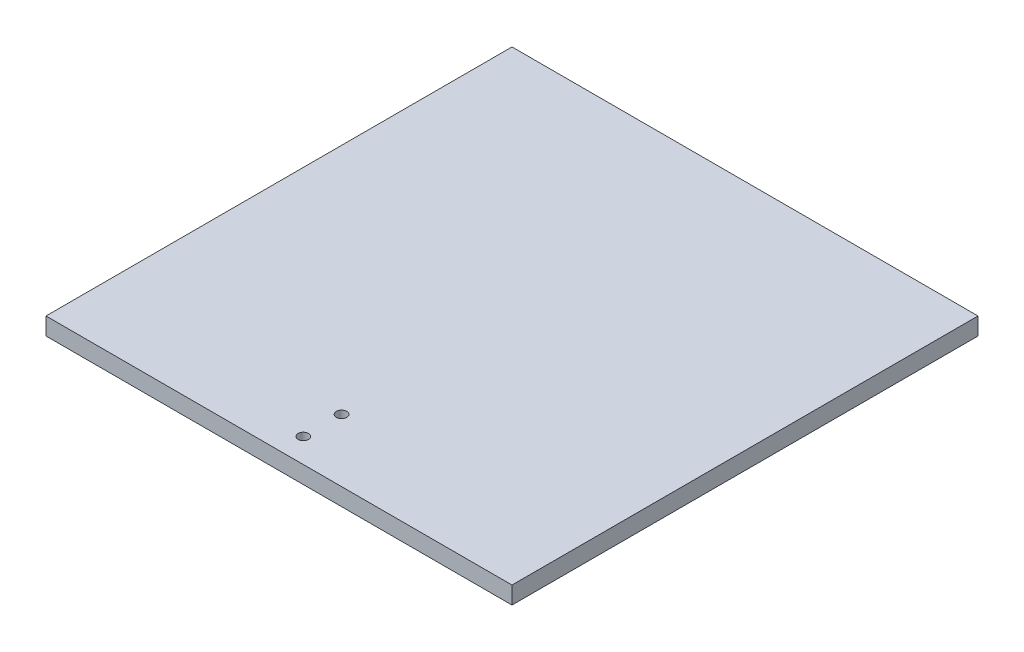
ISO-10303-21;
HEADER;
FILE_DESCRIPTION(('STEP AP214'),'2;1');
FILE_NAME('part.step','',(''),(''),'','','');
FILE_SCHEMA(('AUTOMOTIVE_DESIGN { 1 0 10303 214 1 1 1 1 }'));
ENDSEC;
DATA;
#1=APPLICATION_CONTEXT('core data for automotive mechanical design processes');
#2=APPLICATION_PROTOCOL_DEFINITION('international standard','automotive_design',2000,#1);
#3=PRODUCT_CONTEXT('',#1,'mechanical');
#4=PRODUCT('Part','Part','',(#3));
#5=PRODUCT_RELATED_PRODUCT_CATEGORY('part','',(#4));
#6=PRODUCT_DEFINITION_FORMATION('','',#4);
#7=PRODUCT_DEFINITION_CONTEXT('part definition',#1,'design');
#8=PRODUCT_DEFINITION('design','',#6,#7);
#9=PRODUCT_DEFINITION_SHAPE('','',#8);
#10=(LENGTH_UNIT() NAMED_UNIT(*) SI_UNIT(.MILLI.,.METRE.));
#11=(NAMED_UNIT(*) PLANE_ANGLE_UNIT() SI_UNIT($,.RADIAN.));
#12=(NAMED_UNIT(*) SI_UNIT($,.STERADIAN.) SOLID_ANGLE_UNIT());
#13=UNCERTAINTY_MEASURE_WITH_UNIT(LENGTH_MEASURE(1.E-05),#10,'distance_accuracy_value','');
#14=(GEOMETRIC_REPRESENTATION_CONTEXT(3) GLOBAL_UNCERTAINTY_ASSIGNED_CONTEXT((#13)) GLOBAL_UNIT_ASSIGNED_CONTEXT((#10,
#11,#12)) REPRESENTATION_CONTEXT('',''));
#15=CARTESIAN_POINT('',(0.,0.,0.));
#16=DIRECTION('',(0.,0.,1.));
#17=DIRECTION('',(1.,0.,0.));
#18=AXIS2_PLACEMENT_3D('',#15,#16,#17);
#19=CARTESIAN_POINT('',(-32.7467550804511,5.,-60.336983722081));
#20=DIRECTION('',(1.,0.,0.));
#21=DIRECTION('',(0.,0.,-1.));
#22=AXIS2_PLACEMENT_3D('',#19,#20,#21);
#23=PLANE('',#22);
#24=DIRECTION('',(0.,0.,1.));
#25=VECTOR('',#24,1.);
#26=CARTESIAN_POINT('',(-32.7467550804511,0.,-60.336983722081));
#27=LINE('',#26,#25);
#28=CARTESIAN_POINT('',(-32.7467550804511,0.,-60.336983722081));
#29=VERTEX_POINT('',#28);
#30=CARTESIAN_POINT('',(-32.7467550804511,0.,73.733016277919));
#31=VERTEX_POINT('',#30);
#32=EDGE_CURVE('E96',#29,#31,#27,.T.);
#33=ORIENTED_EDGE('',*,*,#32,.T.);
#34=DIRECTION('',(0.,-1.,0.));
#35=VECTOR('',#34,1.);
#36=CARTESIAN_POINT('',(-32.7467550804511,5.,73.733016277919));
#37=LINE('',#36,#35);
#38=CARTESIAN_POINT('',(-32.7467550804511,5.,73.733016277919));
#39=VERTEX_POINT('',#38);
#40=EDGE_CURVE('E11',#39,#31,#37,.T.);
#41=ORIENTED_EDGE('',*,*,#40,.F.);
#42=DIRECTION('',(0.,0.,1.));
#43=VECTOR('',#42,1.);
#44=CARTESIAN_POINT('',(-32.7467550804511,5.,-60.336983722081));
#45=LINE('',#44,#43);
#46=CARTESIAN_POINT('',(-32.7467550804511,5.,-60.336983722081));
#47=VERTEX_POINT('',#46);
#48=EDGE_CURVE('E84',#47,#39,#45,.T.);
#49=ORIENTED_EDGE('',*,*,#48,.F.);
#50=DIRECTION('',(0.,-1.,0.));
#51=VECTOR('',#50,1.);
#52=CARTESIAN_POINT('',(-32.7467550804511,5.,-60.336983722081));
#53=LINE('',#52,#51);
#54=EDGE_CURVE('E92',#47,#29,#53,.T.);
#55=ORIENTED_EDGE('',*,*,#54,.T.);
#56=EDGE_LOOP('',(#33,#41,#49,#55));
#57=FACE_BOUND('',#56,.T.);
#58=ADVANCED_FACE('F33',(#57),#23,.F.);
#59=CARTESIAN_POINT('',(-32.7467550804511,5.,73.733016277919));
#60=DIRECTION('',(0.,0.,-1.));
#61=DIRECTION('',(-1.,0.,0.));
#62=AXIS2_PLACEMENT_3D('',#59,#60,#61);
#63=PLANE('',#62);
#64=DIRECTION('',(1.,0.,0.));
#65=VECTOR('',#64,1.);
#66=CARTESIAN_POINT('',(-32.7467550804511,0.,73.733016277919));
#67=LINE('',#66,#65);
#68=CARTESIAN_POINT('',(101.323244919549,0.,73.733016277919));
#69=VERTEX_POINT('',#68);
#70=EDGE_CURVE('E88',#31,#69,#67,.T.);
#71=ORIENTED_EDGE('',*,*,#70,.T.);
#72=DIRECTION('',(0.,-1.,0.));
#73=VECTOR('',#72,1.);
#74=CARTESIAN_POINT('',(101.323244919549,5.,73.733016277919));
#75=LINE('',#74,#73);
#76=CARTESIAN_POINT('',(101.323244919549,5.,73.733016277919));
#77=VERTEX_POINT('',#76);
#78=EDGE_CURVE('E41',#77,#69,#75,.T.);
#79=ORIENTED_EDGE('',*,*,#78,.F.);
#80=DIRECTION('',(1.,0.,0.));
#81=VECTOR('',#80,1.);
#82=CARTESIAN_POINT('',(-32.7467550804511,5.,73.733016277919));
#83=LINE('',#82,#81);
#84=EDGE_CURVE('E79',#39,#77,#83,.T.);
#85=ORIENTED_EDGE('',*,*,#84,.F.);
#86=ORIENTED_EDGE('',*,*,#40,.T.);
#87=EDGE_LOOP('',(#71,#79,#85,#86));
#88=FACE_BOUND('',#87,.T.);
#89=ADVANCED_FACE('F87',(#88),#63,.F.);
#90=CARTESIAN_POINT('',(101.323244919549,5.,-60.336983722081));
#91=DIRECTION('',(-1.,0.,0.));
#92=DIRECTION('',(0.,0.,1.));
#93=AXIS2_PLACEMENT_3D('',#90,#91,#92);
#94=PLANE('',#93);
#95=DIRECTION('',(0.,0.,-1.));
#96=VECTOR('',#95,1.);
#97=CARTESIAN_POINT('',(101.323244919549,0.,-60.336983722081));
#98=LINE('',#97,#96);
#99=CARTESIAN_POINT('',(101.323244919549,0.,-60.336983722081));
#100=VERTEX_POINT('',#99);
#101=EDGE_CURVE('E66',#69,#100,#98,.T.);
#102=ORIENTED_EDGE('',*,*,#101,.T.);
#103=DIRECTION('',(0.,-1.,0.));
#104=VECTOR('',#103,1.);
#105=CARTESIAN_POINT('',(101.323244919549,5.,-60.336983722081));
#106=LINE('',#105,#104);
#107=CARTESIAN_POINT('',(101.323244919549,5.,-60.336983722081));
#108=VERTEX_POINT('',#107);
#109=EDGE_CURVE('E89',#108,#100,#106,.T.);
#110=ORIENTED_EDGE('',*,*,#109,.F.);
#111=DIRECTION('',(0.,0.,-1.));
#112=VECTOR('',#111,1.);
#113=CARTESIAN_POINT('',(101.323244919549,5.,-60.336983722081));
#114=LINE('',#113,#112);
#115=EDGE_CURVE('E82',#77,#108,#114,.T.);
#116=ORIENTED_EDGE('',*,*,#115,.F.);
#117=ORIENTED_EDGE('',*,*,#78,.T.);
#118=EDGE_LOOP('',(#102,#110,#116,#117));
#119=FACE_BOUND('',#118,.T.);
#120=ADVANCED_FACE('F90',(#119),#94,.F.);
#121=CARTESIAN_POINT('',(-32.7467550804511,5.,-60.336983722081));
#122=DIRECTION('',(0.,0.,1.));
#123=DIRECTION('',(1.,0.,0.));
#124=AXIS2_PLACEMENT_3D('',#121,#122,#123);
#125=PLANE('',#124);
#126=DIRECTION('',(-1.,0.,0.));
#127=VECTOR('',#126,1.);
#128=CARTESIAN_POINT('',(-32.7467550804511,0.,-60.336983722081));
#129=LINE('',#128,#127);
#130=EDGE_CURVE('E72',#100,#29,#129,.T.);
#131=ORIENTED_EDGE('',*,*,#130,.T.);
#132=ORIENTED_EDGE('',*,*,#54,.F.);
#133=DIRECTION('',(-1.,0.,0.));
#134=VECTOR('',#133,1.);
#135=CARTESIAN_POINT('',(-32.7467550804511,5.,-60.336983722081));
#136=LINE('',#135,#134);
#137=EDGE_CURVE('E49',#108,#47,#136,.T.);
#138=ORIENTED_EDGE('',*,*,#137,.F.);
#139=ORIENTED_EDGE('',*,*,#109,.T.);
#140=EDGE_LOOP('',(#131,#132,#138,#139));
#141=FACE_BOUND('',#140,.T.);
#142=ADVANCED_FACE('F104',(#141),#125,.F.);
#143=CARTESIAN_POINT('',(0.,5.,0.));
#144=DIRECTION('',(0.,1.,0.));
#145=DIRECTION('',(0.,0.,1.));
#146=AXIS2_PLACEMENT_3D('',#143,#144,#145);
#147=PLANE('',#146);
#148=CARTESIAN_POINT('',(34.2882449195489,5.,66.733016277919));
#149=DIRECTION('',(0.,1.,0.));
#150=DIRECTION('',(0.,0.,1.));
#151=AXIS2_PLACEMENT_3D('',#148,#149,#150);
#152=CIRCLE('',#151,1.5);
#153=CARTESIAN_POINT('',(34.2882449195489,5.,68.233016277919));
#154=VERTEX_POINT('',#153);
#155=EDGE_CURVE('E116',#154,#154,#152,.T.);
#156=ORIENTED_EDGE('',*,*,#155,.F.);
#157=EDGE_LOOP('',(#156));
#158=FACE_BOUND('',#157,.T.);
#159=CARTESIAN_POINT('',(34.2882449195489,5.,55.733016277919));
#160=DIRECTION('',(0.,1.,0.));
#161=DIRECTION('',(0.,0.,1.));
#162=AXIS2_PLACEMENT_3D('',#159,#160,#161);
#163=CIRCLE('',#162,1.5);
#164=CARTESIAN_POINT('',(34.2882449195489,5.,57.233016277919));
#165=VERTEX_POINT('',#164);
#166=EDGE_CURVE('E110',#165,#165,#163,.T.);
#167=ORIENTED_EDGE('',*,*,#166,.F.);
#168=EDGE_LOOP('',(#167));
#169=FACE_BOUND('',#168,.T.);
#170=ORIENTED_EDGE('',*,*,#48,.T.);
#171=ORIENTED_EDGE('',*,*,#84,.T.);
#172=ORIENTED_EDGE('',*,*,#115,.T.);
#173=ORIENTED_EDGE('',*,*,#137,.T.);
#174=EDGE_LOOP('',(#170,#171,#172,#173));
#175=FACE_BOUND('',#174,.T.);
#176=ADVANCED_FACE('F80',(#158,#169,#175),#147,.T.);
#177=CARTESIAN_POINT('',(0.,0.,0.));
#178=DIRECTION('',(0.,1.,0.));
#179=DIRECTION('',(0.,0.,1.));
#180=AXIS2_PLACEMENT_3D('',#177,#178,#179);
#181=PLANE('',#180);
#182=CARTESIAN_POINT('',(34.2882449195489,0.,66.733016277919));
#183=DIRECTION('',(0.,1.,0.));
#184=DIRECTION('',(0.,0.,1.));
#185=AXIS2_PLACEMENT_3D('',#182,#183,#184);
#186=CIRCLE('',#185,1.5);
#187=CARTESIAN_POINT('',(34.2882449195489,0.,68.233016277919));
#188=VERTEX_POINT('',#187);
#189=EDGE_CURVE('E113',#188,#188,#186,.T.);
#190=ORIENTED_EDGE('',*,*,#189,.T.);
#191=EDGE_LOOP('',(#190));
#192=FACE_BOUND('',#191,.T.);
#193=CARTESIAN_POINT('',(34.2882449195489,0.,55.733016277919));
#194=DIRECTION('',(0.,1.,0.));
#195=DIRECTION('',(0.,0.,1.));
#196=AXIS2_PLACEMENT_3D('',#193,#194,#195);
#197=CIRCLE('',#196,1.5);
#198=CARTESIAN_POINT('',(34.2882449195489,0.,57.233016277919));
#199=VERTEX_POINT('',#198);
#200=EDGE_CURVE('E99',#199,#199,#197,.T.);
#201=ORIENTED_EDGE('',*,*,#200,.T.);
#202=EDGE_LOOP('',(#201));
#203=FACE_BOUND('',#202,.T.);
#204=ORIENTED_EDGE('',*,*,#32,.F.);
#205=ORIENTED_EDGE('',*,*,#130,.F.);
#206=ORIENTED_EDGE('',*,*,#101,.F.);
#207=ORIENTED_EDGE('',*,*,#70,.F.);
#208=EDGE_LOOP('',(#204,#205,#206,#207));
#209=FACE_BOUND('',#208,.T.);
#210=ADVANCED_FACE('F107',(#192,#203,#209),#181,.F.);
#211=CARTESIAN_POINT('',(34.2882449195489,0.,55.733016277919));
#212=DIRECTION('',(0.,1.,0.));
#213=DIRECTION('',(0.,0.,1.));
#214=AXIS2_PLACEMENT_3D('',#211,#212,#213);
#215=CYLINDRICAL_SURFACE('',#214,1.5);
#216=ORIENTED_EDGE('',*,*,#200,.F.);
#217=EDGE_LOOP('',(#216));
#218=FACE_BOUND('',#217,.T.);
#219=ORIENTED_EDGE('',*,*,#166,.T.);
#220=EDGE_LOOP('',(#219));
#221=FACE_BOUND('',#220,.T.);
#222=ADVANCED_FACE('F127',(#218,#221),#215,.F.);
#223=CARTESIAN_POINT('',(34.2882449195489,0.,66.733016277919));
#224=DIRECTION('',(0.,1.,0.));
#225=DIRECTION('',(0.,0.,1.));
#226=AXIS2_PLACEMENT_3D('',#223,#224,#225);
#227=CYLINDRICAL_SURFACE('',#226,1.5);
#228=ORIENTED_EDGE('',*,*,#189,.F.);
#229=EDGE_LOOP('',(#228));
#230=FACE_BOUND('',#229,.T.);
#231=ORIENTED_EDGE('',*,*,#155,.T.);
#232=EDGE_LOOP('',(#231));
#233=FACE_BOUND('',#232,.T.);
#234=ADVANCED_FACE('F124',(#230,#233),#227,.F.);
#235=CLOSED_SHELL('',(#58,#89,#120,#142,#176,#210,#222,#234));
#236=MANIFOLD_SOLID_BREP('B2',#235);
#237=ADVANCED_BREP_SHAPE_REPRESENTATION('',(#18,#236),#14);
#238=SHAPE_DEFINITION_REPRESENTATION(#9,#237);
ENDSEC;
END-ISO-10303-21;
